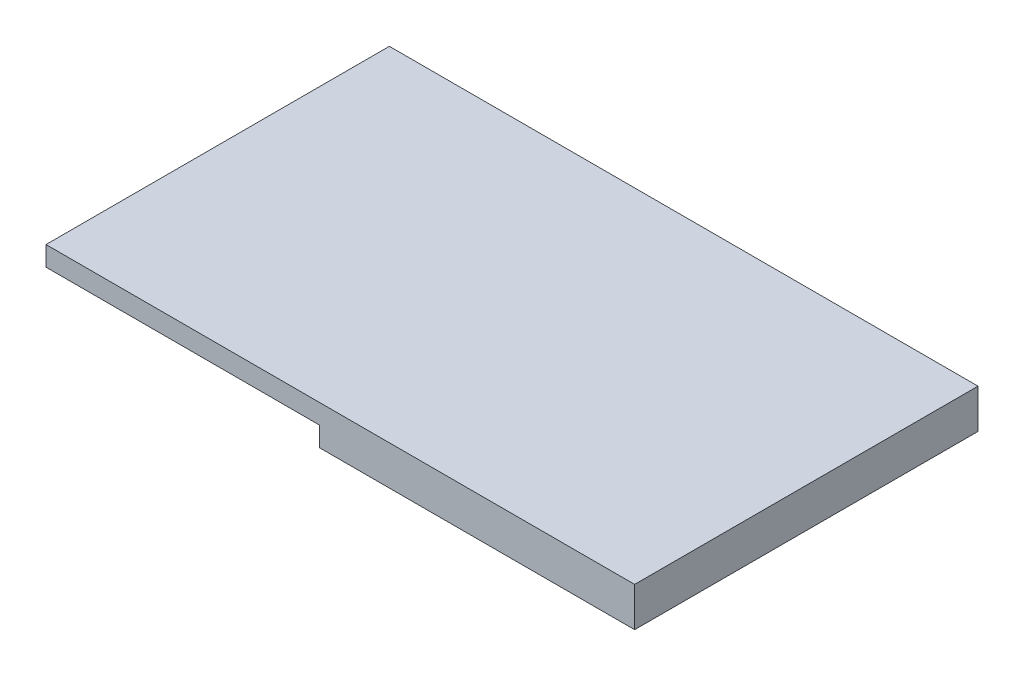
ISO-10303-21;
HEADER;
FILE_DESCRIPTION(('STEP AP214'),'2;1');
FILE_NAME('part.step','',(''),(''),'','','');
FILE_SCHEMA(('AUTOMOTIVE_DESIGN { 1 0 10303 214 1 1 1 1 }'));
ENDSEC;
DATA;
#1=APPLICATION_CONTEXT('core data for automotive mechanical design processes');
#2=APPLICATION_PROTOCOL_DEFINITION('international standard','automotive_design',2000,#1);
#3=PRODUCT_CONTEXT('',#1,'mechanical');
#4=PRODUCT('Part','Part','',(#3));
#5=PRODUCT_RELATED_PRODUCT_CATEGORY('part','',(#4));
#6=PRODUCT_DEFINITION_FORMATION('','',#4);
#7=PRODUCT_DEFINITION_CONTEXT('part definition',#1,'design');
#8=PRODUCT_DEFINITION('design','',#6,#7);
#9=PRODUCT_DEFINITION_SHAPE('','',#8);
#10=(LENGTH_UNIT() NAMED_UNIT(*) SI_UNIT(.MILLI.,.METRE.));
#11=(NAMED_UNIT(*) PLANE_ANGLE_UNIT() SI_UNIT($,.RADIAN.));
#12=(NAMED_UNIT(*) SI_UNIT($,.STERADIAN.) SOLID_ANGLE_UNIT());
#13=UNCERTAINTY_MEASURE_WITH_UNIT(LENGTH_MEASURE(1.E-05),#10,'distance_accuracy_value','');
#14=(GEOMETRIC_REPRESENTATION_CONTEXT(3) GLOBAL_UNCERTAINTY_ASSIGNED_CONTEXT((#13)) GLOBAL_UNIT_ASSIGNED_CONTEXT((#10,
#11,#12)) REPRESENTATION_CONTEXT('',''));
#15=CARTESIAN_POINT('',(0.,0.,0.));
#16=DIRECTION('',(0.,0.,1.));
#17=DIRECTION('',(1.,0.,0.));
#18=AXIS2_PLACEMENT_3D('',#15,#16,#17);
#19=CARTESIAN_POINT('',(-30.,4.,-17.5));
#20=DIRECTION('',(1.,0.,0.));
#21=DIRECTION('',(0.,0.,-1.));
#22=AXIS2_PLACEMENT_3D('',#19,#20,#21);
#23=PLANE('',#22);
#24=DIRECTION('',(0.,0.,-1.));
#25=VECTOR('',#24,1.);
#26=CARTESIAN_POINT('',(-30.,2.,17.5));
#27=LINE('',#26,#25);
#28=CARTESIAN_POINT('',(-30.,2.,17.5));
#29=VERTEX_POINT('',#28);
#30=CARTESIAN_POINT('',(-30.,2.,-17.5));
#31=VERTEX_POINT('',#30);
#32=EDGE_CURVE('E95',#29,#31,#27,.T.);
#33=ORIENTED_EDGE('',*,*,#32,.F.);
#34=DIRECTION('',(0.,-1.,0.));
#35=VECTOR('',#34,1.);
#36=CARTESIAN_POINT('',(-30.,4.,17.5));
#37=LINE('',#36,#35);
#38=CARTESIAN_POINT('',(-30.,4.,17.5));
#39=VERTEX_POINT('',#38);
#40=EDGE_CURVE('E114',#39,#29,#37,.T.);
#41=ORIENTED_EDGE('',*,*,#40,.F.);
#42=DIRECTION('',(0.,0.,1.));
#43=VECTOR('',#42,1.);
#44=CARTESIAN_POINT('',(-30.,4.,-17.5));
#45=LINE('',#44,#43);
#46=CARTESIAN_POINT('',(-30.,4.,-17.5));
#47=VERTEX_POINT('',#46);
#48=EDGE_CURVE('E113',#47,#39,#45,.T.);
#49=ORIENTED_EDGE('',*,*,#48,.F.);
#50=DIRECTION('',(0.,-1.,0.));
#51=VECTOR('',#50,1.);
#52=CARTESIAN_POINT('',(-30.,4.,-17.5));
#53=LINE('',#52,#51);
#54=EDGE_CURVE('E41',#47,#31,#53,.T.);
#55=ORIENTED_EDGE('',*,*,#54,.T.);
#56=EDGE_LOOP('',(#33,#41,#49,#55));
#57=FACE_BOUND('',#56,.T.);
#58=ADVANCED_FACE('F33',(#57),#23,.F.);
#59=CARTESIAN_POINT('',(30.,4.,-17.5));
#60=DIRECTION('',(-1.,0.,0.));
#61=DIRECTION('',(0.,0.,1.));
#62=AXIS2_PLACEMENT_3D('',#59,#60,#61);
#63=PLANE('',#62);
#64=DIRECTION('',(0.,0.,-1.));
#65=VECTOR('',#64,1.);
#66=CARTESIAN_POINT('',(30.,0.,-17.5));
#67=LINE('',#66,#65);
#68=CARTESIAN_POINT('',(30.,0.,17.5));
#69=VERTEX_POINT('',#68);
#70=CARTESIAN_POINT('',(30.,0.,-17.5));
#71=VERTEX_POINT('',#70);
#72=EDGE_CURVE('E123',#69,#71,#67,.T.);
#73=ORIENTED_EDGE('',*,*,#72,.T.);
#74=DIRECTION('',(0.,-1.,0.));
#75=VECTOR('',#74,1.);
#76=CARTESIAN_POINT('',(30.,4.,-17.5));
#77=LINE('',#76,#75);
#78=CARTESIAN_POINT('',(30.,4.,-17.5));
#79=VERTEX_POINT('',#78);
#80=EDGE_CURVE('E11',#79,#71,#77,.T.);
#81=ORIENTED_EDGE('',*,*,#80,.F.);
#82=DIRECTION('',(0.,0.,-1.));
#83=VECTOR('',#82,1.);
#84=CARTESIAN_POINT('',(30.,4.,-17.5));
#85=LINE('',#84,#83);
#86=CARTESIAN_POINT('',(30.,4.,17.5));
#87=VERTEX_POINT('',#86);
#88=EDGE_CURVE('E120',#87,#79,#85,.T.);
#89=ORIENTED_EDGE('',*,*,#88,.F.);
#90=DIRECTION('',(0.,-1.,0.));
#91=VECTOR('',#90,1.);
#92=CARTESIAN_POINT('',(30.,4.,17.5));
#93=LINE('',#92,#91);
#94=EDGE_CURVE('E115',#87,#69,#93,.T.);
#95=ORIENTED_EDGE('',*,*,#94,.T.);
#96=EDGE_LOOP('',(#73,#81,#89,#95));
#97=FACE_BOUND('',#96,.T.);
#98=ADVANCED_FACE('F35',(#97),#63,.F.);
#99=CARTESIAN_POINT('',(-30.,4.,-17.5));
#100=DIRECTION('',(0.,0.,1.));
#101=DIRECTION('',(1.,0.,0.));
#102=AXIS2_PLACEMENT_3D('',#99,#100,#101);
#103=PLANE('',#102);
#104=DIRECTION('',(-1.,0.,0.));
#105=VECTOR('',#104,1.);
#106=CARTESIAN_POINT('',(-30.,0.,-17.5));
#107=LINE('',#106,#105);
#108=CARTESIAN_POINT('',(-2.11461834425317,0.,-17.5));
#109=VERTEX_POINT('',#108);
#110=EDGE_CURVE('E121',#71,#109,#107,.T.);
#111=ORIENTED_EDGE('',*,*,#110,.T.);
#112=DIRECTION('',(0.,-1.,0.));
#113=VECTOR('',#112,1.);
#114=CARTESIAN_POINT('',(-2.11461834425317,2.,-17.5));
#115=LINE('',#114,#113);
#116=CARTESIAN_POINT('',(-2.11461834425317,2.,-17.5));
#117=VERTEX_POINT('',#116);
#118=EDGE_CURVE('E48',#117,#109,#115,.T.);
#119=ORIENTED_EDGE('',*,*,#118,.F.);
#120=DIRECTION('',(1.,0.,0.));
#121=VECTOR('',#120,1.);
#122=CARTESIAN_POINT('',(-30.,2.,-17.5));
#123=LINE('',#122,#121);
#124=EDGE_CURVE('E99',#31,#117,#123,.T.);
#125=ORIENTED_EDGE('',*,*,#124,.F.);
#126=ORIENTED_EDGE('',*,*,#54,.F.);
#127=DIRECTION('',(-1.,0.,0.));
#128=VECTOR('',#127,1.);
#129=CARTESIAN_POINT('',(-30.,4.,-17.5));
#130=LINE('',#129,#128);
#131=EDGE_CURVE('E79',#79,#47,#130,.T.);
#132=ORIENTED_EDGE('',*,*,#131,.F.);
#133=ORIENTED_EDGE('',*,*,#80,.T.);
#134=EDGE_LOOP('',(#111,#119,#125,#126,#132,#133));
#135=FACE_BOUND('',#134,.T.);
#136=ADVANCED_FACE('F109',(#135),#103,.F.);
#137=CARTESIAN_POINT('',(-30.,4.,17.5));
#138=DIRECTION('',(0.,0.,-1.));
#139=DIRECTION('',(-1.,0.,0.));
#140=AXIS2_PLACEMENT_3D('',#137,#138,#139);
#141=PLANE('',#140);
#142=DIRECTION('',(-1.,0.,0.));
#143=VECTOR('',#142,1.);
#144=CARTESIAN_POINT('',(-30.,2.,17.5));
#145=LINE('',#144,#143);
#146=CARTESIAN_POINT('',(-2.11461834425317,2.,17.5));
#147=VERTEX_POINT('',#146);
#148=EDGE_CURVE('E101',#147,#29,#145,.T.);
#149=ORIENTED_EDGE('',*,*,#148,.F.);
#150=DIRECTION('',(0.,-1.,0.));
#151=VECTOR('',#150,1.);
#152=CARTESIAN_POINT('',(-2.11461834425317,2.,17.5));
#153=LINE('',#152,#151);
#154=CARTESIAN_POINT('',(-2.11461834425317,0.,17.5));
#155=VERTEX_POINT('',#154);
#156=EDGE_CURVE('E126',#147,#155,#153,.T.);
#157=ORIENTED_EDGE('',*,*,#156,.T.);
#158=DIRECTION('',(1.,0.,0.));
#159=VECTOR('',#158,1.);
#160=CARTESIAN_POINT('',(-30.,0.,17.5));
#161=LINE('',#160,#159);
#162=EDGE_CURVE('E72',#155,#69,#161,.T.);
#163=ORIENTED_EDGE('',*,*,#162,.T.);
#164=ORIENTED_EDGE('',*,*,#94,.F.);
#165=DIRECTION('',(1.,0.,0.));
#166=VECTOR('',#165,1.);
#167=CARTESIAN_POINT('',(-30.,4.,17.5));
#168=LINE('',#167,#166);
#169=EDGE_CURVE('E57',#39,#87,#168,.T.);
#170=ORIENTED_EDGE('',*,*,#169,.F.);
#171=ORIENTED_EDGE('',*,*,#40,.T.);
#172=EDGE_LOOP('',(#149,#157,#163,#164,#170,#171));
#173=FACE_BOUND('',#172,.T.);
#174=ADVANCED_FACE('F135',(#173),#141,.F.);
#175=CARTESIAN_POINT('',(0.,4.,0.));
#176=DIRECTION('',(0.,1.,0.));
#177=DIRECTION('',(0.,0.,1.));
#178=AXIS2_PLACEMENT_3D('',#175,#176,#177);
#179=PLANE('',#178);
#180=ORIENTED_EDGE('',*,*,#88,.T.);
#181=ORIENTED_EDGE('',*,*,#131,.T.);
#182=ORIENTED_EDGE('',*,*,#48,.T.);
#183=ORIENTED_EDGE('',*,*,#169,.T.);
#184=EDGE_LOOP('',(#180,#181,#182,#183));
#185=FACE_BOUND('',#184,.T.);
#186=ADVANCED_FACE('F140',(#185),#179,.T.);
#187=CARTESIAN_POINT('',(0.,0.,0.));
#188=DIRECTION('',(0.,1.,0.));
#189=DIRECTION('',(0.,0.,1.));
#190=AXIS2_PLACEMENT_3D('',#187,#188,#189);
#191=PLANE('',#190);
#192=ORIENTED_EDGE('',*,*,#162,.F.);
#193=DIRECTION('',(0.,0.,1.));
#194=VECTOR('',#193,1.);
#195=CARTESIAN_POINT('',(-2.11461834425317,0.,17.5));
#196=LINE('',#195,#194);
#197=EDGE_CURVE('E106',#109,#155,#196,.T.);
#198=ORIENTED_EDGE('',*,*,#197,.F.);
#199=ORIENTED_EDGE('',*,*,#110,.F.);
#200=ORIENTED_EDGE('',*,*,#72,.F.);
#201=EDGE_LOOP('',(#192,#198,#199,#200));
#202=FACE_BOUND('',#201,.T.);
#203=ADVANCED_FACE('F142',(#202),#191,.F.);
#204=CARTESIAN_POINT('',(-2.11461834425317,2.,17.5));
#205=DIRECTION('',(1.,0.,0.));
#206=DIRECTION('',(0.,0.,-1.));
#207=AXIS2_PLACEMENT_3D('',#204,#205,#206);
#208=PLANE('',#207);
#209=ORIENTED_EDGE('',*,*,#197,.T.);
#210=ORIENTED_EDGE('',*,*,#156,.F.);
#211=DIRECTION('',(0.,0.,1.));
#212=VECTOR('',#211,1.);
#213=CARTESIAN_POINT('',(-2.11461834425317,2.,17.5));
#214=LINE('',#213,#212);
#215=EDGE_CURVE('E111',#117,#147,#214,.T.);
#216=ORIENTED_EDGE('',*,*,#215,.F.);
#217=ORIENTED_EDGE('',*,*,#118,.T.);
#218=EDGE_LOOP('',(#209,#210,#216,#217));
#219=FACE_BOUND('',#218,.T.);
#220=ADVANCED_FACE('F148',(#219),#208,.F.);
#221=CARTESIAN_POINT('',(0.,2.,0.));
#222=DIRECTION('',(0.,-1.,0.));
#223=DIRECTION('',(0.,0.,-1.));
#224=AXIS2_PLACEMENT_3D('',#221,#222,#223);
#225=PLANE('',#224);
#226=ORIENTED_EDGE('',*,*,#32,.T.);
#227=ORIENTED_EDGE('',*,*,#124,.T.);
#228=ORIENTED_EDGE('',*,*,#215,.T.);
#229=ORIENTED_EDGE('',*,*,#148,.T.);
#230=EDGE_LOOP('',(#226,#227,#228,#229));
#231=FACE_BOUND('',#230,.T.);
#232=ADVANCED_FACE('F97',(#231),#225,.T.);
#233=CLOSED_SHELL('',(#58,#98,#136,#174,#186,#203,#220,#232));
#234=MANIFOLD_SOLID_BREP('B2',#233);
#235=ADVANCED_BREP_SHAPE_REPRESENTATION('',(#18,#234),#14);
#236=SHAPE_DEFINITION_REPRESENTATION(#9,#235);
ENDSEC;
END-ISO-10303-21;
